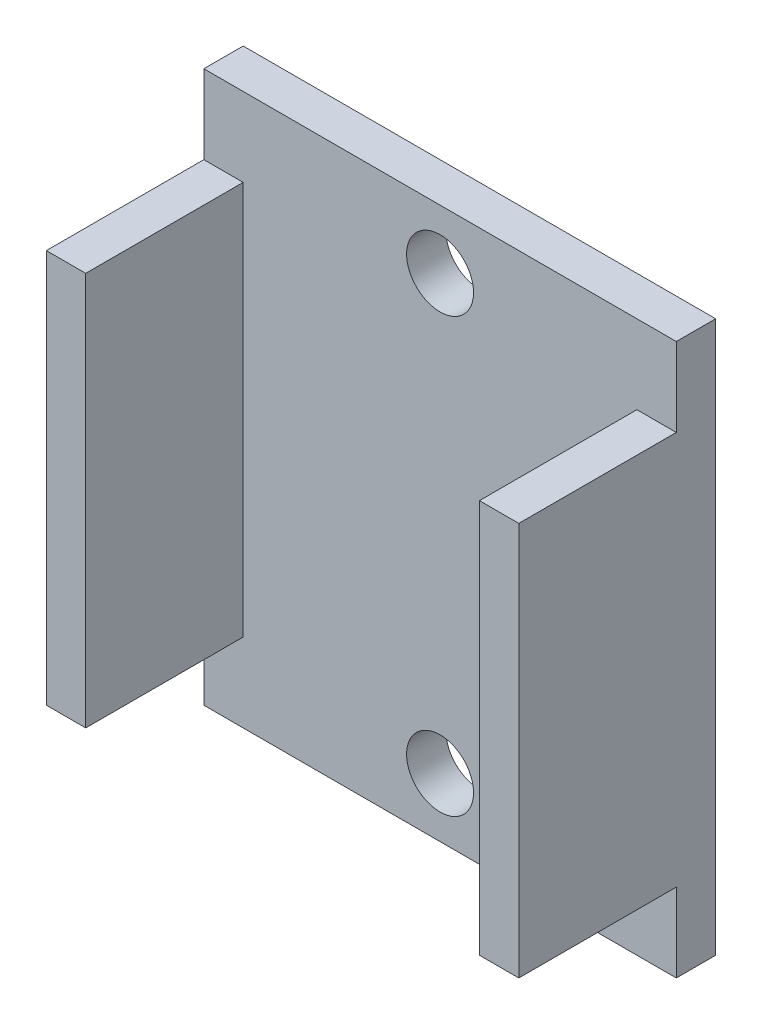
ISO-10303-21;
HEADER;
FILE_DESCRIPTION(('STEP AP214'),'2;1');
FILE_NAME('part.step','',(''),(''),'','','');
FILE_SCHEMA(('AUTOMOTIVE_DESIGN { 1 0 10303 214 1 1 1 1 }'));
ENDSEC;
DATA;
#1=APPLICATION_CONTEXT('core data for automotive mechanical design processes');
#2=APPLICATION_PROTOCOL_DEFINITION('international standard','automotive_design',2000,#1);
#3=PRODUCT_CONTEXT('',#1,'mechanical');
#4=PRODUCT('Part','Part','',(#3));
#5=PRODUCT_RELATED_PRODUCT_CATEGORY('part','',(#4));
#6=PRODUCT_DEFINITION_FORMATION('','',#4);
#7=PRODUCT_DEFINITION_CONTEXT('part definition',#1,'design');
#8=PRODUCT_DEFINITION('design','',#6,#7);
#9=PRODUCT_DEFINITION_SHAPE('','',#8);
#10=(LENGTH_UNIT() NAMED_UNIT(*) SI_UNIT(.MILLI.,.METRE.));
#11=(NAMED_UNIT(*) PLANE_ANGLE_UNIT() SI_UNIT($,.RADIAN.));
#12=(NAMED_UNIT(*) SI_UNIT($,.STERADIAN.) SOLID_ANGLE_UNIT());
#13=UNCERTAINTY_MEASURE_WITH_UNIT(LENGTH_MEASURE(1.E-05),#10,'distance_accuracy_value','');
#14=(GEOMETRIC_REPRESENTATION_CONTEXT(3) GLOBAL_UNCERTAINTY_ASSIGNED_CONTEXT((#13)) GLOBAL_UNIT_ASSIGNED_CONTEXT((#10,
#11,#12)) REPRESENTATION_CONTEXT('',''));
#15=CARTESIAN_POINT('',(0.,0.,0.));
#16=DIRECTION('',(0.,0.,1.));
#17=DIRECTION('',(1.,0.,0.));
#18=AXIS2_PLACEMENT_3D('',#15,#16,#17);
#19=CARTESIAN_POINT('',(0.,0.,90.));
#20=DIRECTION('',(0.,0.,-1.));
#21=DIRECTION('',(-1.,0.,0.));
#22=AXIS2_PLACEMENT_3D('',#19,#20,#21);
#23=PLANE('',#22);
#24=CARTESIAN_POINT('',(-190.,-11.,90.));
#25=DIRECTION('',(0.,0.,1.));
#26=DIRECTION('',(1.,0.,0.));
#27=AXIS2_PLACEMENT_3D('',#24,#25,#26);
#28=CIRCLE('',#27,1.70000000000001);
#29=CARTESIAN_POINT('',(-188.3,-11.,90.));
#30=VERTEX_POINT('',#29);
#31=EDGE_CURVE('E194',#30,#30,#28,.T.);
#32=ORIENTED_EDGE('',*,*,#31,.F.);
#33=EDGE_LOOP('',(#32));
#34=FACE_BOUND('',#33,.T.);
#35=CARTESIAN_POINT('',(-190.,11.,90.));
#36=DIRECTION('',(0.,0.,1.));
#37=DIRECTION('',(1.,0.,0.));
#38=AXIS2_PLACEMENT_3D('',#35,#36,#37);
#39=CIRCLE('',#38,1.70000000000001);
#40=CARTESIAN_POINT('',(-188.3,11.,90.));
#41=VERTEX_POINT('',#40);
#42=EDGE_CURVE('E153',#41,#41,#39,.T.);
#43=ORIENTED_EDGE('',*,*,#42,.F.);
#44=EDGE_LOOP('',(#43));
#45=FACE_BOUND('',#44,.T.);
#46=DIRECTION('',(-1.,0.,0.));
#47=VECTOR('',#46,1.);
#48=CARTESIAN_POINT('',(-180.,10.,90.));
#49=LINE('',#48,#47);
#50=CARTESIAN_POINT('',(-178.,10.,90.));
#51=VERTEX_POINT('',#50);
#52=CARTESIAN_POINT('',(-180.,10.,90.));
#53=VERTEX_POINT('',#52);
#54=EDGE_CURVE('E150',#51,#53,#49,.T.);
#55=ORIENTED_EDGE('',*,*,#54,.F.);
#56=DIRECTION('',(0.,1.,0.));
#57=VECTOR('',#56,1.);
#58=CARTESIAN_POINT('',(-178.,14.,90.));
#59=LINE('',#58,#57);
#60=CARTESIAN_POINT('',(-178.,14.,90.));
#61=VERTEX_POINT('',#60);
#62=EDGE_CURVE('E210',#51,#61,#59,.T.);
#63=ORIENTED_EDGE('',*,*,#62,.T.);
#64=DIRECTION('',(-1.,0.,0.));
#65=VECTOR('',#64,1.);
#66=CARTESIAN_POINT('',(-202.,14.,90.));
#67=LINE('',#66,#65);
#68=CARTESIAN_POINT('',(-202.,14.,90.));
#69=VERTEX_POINT('',#68);
#70=EDGE_CURVE('E196',#61,#69,#67,.T.);
#71=ORIENTED_EDGE('',*,*,#70,.T.);
#72=DIRECTION('',(0.,-1.,0.));
#73=VECTOR('',#72,1.);
#74=CARTESIAN_POINT('',(-202.,14.,90.));
#75=LINE('',#74,#73);
#76=CARTESIAN_POINT('',(-202.,10.,90.));
#77=VERTEX_POINT('',#76);
#78=EDGE_CURVE('E201',#69,#77,#75,.T.);
#79=ORIENTED_EDGE('',*,*,#78,.T.);
#80=DIRECTION('',(-1.,0.,0.));
#81=VECTOR('',#80,1.);
#82=CARTESIAN_POINT('',(-202.,10.,90.));
#83=LINE('',#82,#81);
#84=CARTESIAN_POINT('',(-200.,10.,90.));
#85=VERTEX_POINT('',#84);
#86=EDGE_CURVE('E171',#85,#77,#83,.T.);
#87=ORIENTED_EDGE('',*,*,#86,.F.);
#88=DIRECTION('',(0.,1.,0.));
#89=VECTOR('',#88,1.);
#90=CARTESIAN_POINT('',(-200.,10.,90.));
#91=LINE('',#90,#89);
#92=CARTESIAN_POINT('',(-200.,-10.,90.));
#93=VERTEX_POINT('',#92);
#94=EDGE_CURVE('E172',#93,#85,#91,.T.);
#95=ORIENTED_EDGE('',*,*,#94,.F.);
#96=DIRECTION('',(1.,0.,0.));
#97=VECTOR('',#96,1.);
#98=CARTESIAN_POINT('',(-202.,-10.,90.));
#99=LINE('',#98,#97);
#100=CARTESIAN_POINT('',(-202.,-10.,90.));
#101=VERTEX_POINT('',#100);
#102=EDGE_CURVE('E176',#101,#93,#99,.T.);
#103=ORIENTED_EDGE('',*,*,#102,.F.);
#104=CARTESIAN_POINT('',(-202.,-14.,90.));
#105=VERTEX_POINT('',#104);
#106=EDGE_CURVE('E203',#101,#105,#75,.T.);
#107=ORIENTED_EDGE('',*,*,#106,.T.);
#108=DIRECTION('',(1.,0.,0.));
#109=VECTOR('',#108,1.);
#110=CARTESIAN_POINT('',(-202.,-14.,90.));
#111=LINE('',#110,#109);
#112=CARTESIAN_POINT('',(-178.,-14.,90.));
#113=VERTEX_POINT('',#112);
#114=EDGE_CURVE('E202',#105,#113,#111,.T.);
#115=ORIENTED_EDGE('',*,*,#114,.T.);
#116=CARTESIAN_POINT('',(-178.,-10.,90.));
#117=VERTEX_POINT('',#116);
#118=EDGE_CURVE('E208',#113,#117,#59,.T.);
#119=ORIENTED_EDGE('',*,*,#118,.T.);
#120=DIRECTION('',(1.,0.,0.));
#121=VECTOR('',#120,1.);
#122=CARTESIAN_POINT('',(-180.,-10.,90.));
#123=LINE('',#122,#121);
#124=CARTESIAN_POINT('',(-180.,-10.,90.));
#125=VERTEX_POINT('',#124);
#126=EDGE_CURVE('E64',#125,#117,#123,.T.);
#127=ORIENTED_EDGE('',*,*,#126,.F.);
#128=DIRECTION('',(0.,-1.,0.));
#129=VECTOR('',#128,1.);
#130=CARTESIAN_POINT('',(-180.,10.,90.));
#131=LINE('',#130,#129);
#132=EDGE_CURVE('E57',#53,#125,#131,.T.);
#133=ORIENTED_EDGE('',*,*,#132,.F.);
#134=EDGE_LOOP('',(#55,#63,#71,#79,#87,#95,#103,#107,#115,#119,#127,#133));
#135=FACE_BOUND('',#134,.T.);
#136=ADVANCED_FACE('F41',(#34,#45,#135),#23,.F.);
#137=CARTESIAN_POINT('',(0.,0.,88.));
#138=DIRECTION('',(0.,0.,-1.));
#139=DIRECTION('',(-1.,0.,0.));
#140=AXIS2_PLACEMENT_3D('',#137,#138,#139);
#141=PLANE('',#140);
#142=CARTESIAN_POINT('',(-190.,-11.,88.));
#143=DIRECTION('',(0.,0.,1.));
#144=DIRECTION('',(1.,0.,0.));
#145=AXIS2_PLACEMENT_3D('',#142,#143,#144);
#146=CIRCLE('',#145,1.70000000000001);
#147=CARTESIAN_POINT('',(-188.3,-11.,88.));
#148=VERTEX_POINT('',#147);
#149=EDGE_CURVE('E187',#148,#148,#146,.T.);
#150=ORIENTED_EDGE('',*,*,#149,.T.);
#151=EDGE_LOOP('',(#150));
#152=FACE_BOUND('',#151,.T.);
#153=DIRECTION('',(-1.,0.,0.));
#154=VECTOR('',#153,1.);
#155=CARTESIAN_POINT('',(-202.,14.,88.));
#156=LINE('',#155,#154);
#157=CARTESIAN_POINT('',(-178.,14.,88.));
#158=VERTEX_POINT('',#157);
#159=CARTESIAN_POINT('',(-202.,14.,88.));
#160=VERTEX_POINT('',#159);
#161=EDGE_CURVE('E193',#158,#160,#156,.T.);
#162=ORIENTED_EDGE('',*,*,#161,.F.);
#163=DIRECTION('',(0.,1.,0.));
#164=VECTOR('',#163,1.);
#165=CARTESIAN_POINT('',(-178.,14.,88.));
#166=LINE('',#165,#164);
#167=CARTESIAN_POINT('',(-178.,-14.,88.));
#168=VERTEX_POINT('',#167);
#169=EDGE_CURVE('E205',#168,#158,#166,.T.);
#170=ORIENTED_EDGE('',*,*,#169,.F.);
#171=DIRECTION('',(1.,0.,0.));
#172=VECTOR('',#171,1.);
#173=CARTESIAN_POINT('',(-202.,-14.,88.));
#174=LINE('',#173,#172);
#175=CARTESIAN_POINT('',(-202.,-14.,88.));
#176=VERTEX_POINT('',#175);
#177=EDGE_CURVE('E214',#176,#168,#174,.T.);
#178=ORIENTED_EDGE('',*,*,#177,.F.);
#179=DIRECTION('',(0.,-1.,0.));
#180=VECTOR('',#179,1.);
#181=CARTESIAN_POINT('',(-202.,14.,88.));
#182=LINE('',#181,#180);
#183=EDGE_CURVE('E213',#160,#176,#182,.T.);
#184=ORIENTED_EDGE('',*,*,#183,.F.);
#185=EDGE_LOOP('',(#162,#170,#178,#184));
#186=FACE_BOUND('',#185,.T.);
#187=CARTESIAN_POINT('',(-190.,11.,88.));
#188=DIRECTION('',(0.,0.,1.));
#189=DIRECTION('',(1.,0.,0.));
#190=AXIS2_PLACEMENT_3D('',#187,#188,#189);
#191=CIRCLE('',#190,1.70000000000001);
#192=CARTESIAN_POINT('',(-188.3,11.,88.));
#193=VERTEX_POINT('',#192);
#194=EDGE_CURVE('E147',#193,#193,#191,.T.);
#195=ORIENTED_EDGE('',*,*,#194,.T.);
#196=EDGE_LOOP('',(#195));
#197=FACE_BOUND('',#196,.T.);
#198=ADVANCED_FACE('F231',(#152,#186,#197),#141,.T.);
#199=CARTESIAN_POINT('',(-202.,14.,90.));
#200=DIRECTION('',(0.,-1.,0.));
#201=DIRECTION('',(0.,0.,-1.));
#202=AXIS2_PLACEMENT_3D('',#199,#200,#201);
#203=PLANE('',#202);
#204=ORIENTED_EDGE('',*,*,#161,.T.);
#205=DIRECTION('',(0.,0.,-1.));
#206=VECTOR('',#205,1.);
#207=CARTESIAN_POINT('',(-202.,14.,90.));
#208=LINE('',#207,#206);
#209=EDGE_CURVE('E11',#69,#160,#208,.T.);
#210=ORIENTED_EDGE('',*,*,#209,.F.);
#211=ORIENTED_EDGE('',*,*,#70,.F.);
#212=DIRECTION('',(0.,0.,-1.));
#213=VECTOR('',#212,1.);
#214=CARTESIAN_POINT('',(-178.,14.,90.));
#215=LINE('',#214,#213);
#216=EDGE_CURVE('E209',#61,#158,#215,.T.);
#217=ORIENTED_EDGE('',*,*,#216,.T.);
#218=EDGE_LOOP('',(#204,#210,#211,#217));
#219=FACE_BOUND('',#218,.T.);
#220=ADVANCED_FACE('F43',(#219),#203,.F.);
#221=CARTESIAN_POINT('',(-202.,14.,90.));
#222=DIRECTION('',(1.,0.,0.));
#223=DIRECTION('',(0.,0.,-1.));
#224=AXIS2_PLACEMENT_3D('',#221,#222,#223);
#225=PLANE('',#224);
#226=ORIENTED_EDGE('',*,*,#183,.T.);
#227=DIRECTION('',(0.,0.,-1.));
#228=VECTOR('',#227,1.);
#229=CARTESIAN_POINT('',(-202.,-14.,90.));
#230=LINE('',#229,#228);
#231=EDGE_CURVE('E47',#105,#176,#230,.T.);
#232=ORIENTED_EDGE('',*,*,#231,.F.);
#233=ORIENTED_EDGE('',*,*,#106,.F.);
#234=DIRECTION('',(0.,0.,-1.));
#235=VECTOR('',#234,1.);
#236=CARTESIAN_POINT('',(-202.,-10.,98.));
#237=LINE('',#236,#235);
#238=CARTESIAN_POINT('',(-202.,-10.,98.));
#239=VERTEX_POINT('',#238);
#240=EDGE_CURVE('E157',#239,#101,#237,.T.);
#241=ORIENTED_EDGE('',*,*,#240,.F.);
#242=DIRECTION('',(0.,-1.,0.));
#243=VECTOR('',#242,1.);
#244=CARTESIAN_POINT('',(-202.,10.,98.));
#245=LINE('',#244,#243);
#246=CARTESIAN_POINT('',(-202.,10.,98.));
#247=VERTEX_POINT('',#246);
#248=EDGE_CURVE('E177',#247,#239,#245,.T.);
#249=ORIENTED_EDGE('',*,*,#248,.F.);
#250=DIRECTION('',(0.,0.,-1.));
#251=VECTOR('',#250,1.);
#252=CARTESIAN_POINT('',(-202.,10.,98.));
#253=LINE('',#252,#251);
#254=EDGE_CURVE('E169',#247,#77,#253,.T.);
#255=ORIENTED_EDGE('',*,*,#254,.T.);
#256=ORIENTED_EDGE('',*,*,#78,.F.);
#257=ORIENTED_EDGE('',*,*,#209,.T.);
#258=EDGE_LOOP('',(#226,#232,#233,#241,#249,#255,#256,#257));
#259=FACE_BOUND('',#258,.T.);
#260=ADVANCED_FACE('F258',(#259),#225,.F.);
#261=CARTESIAN_POINT('',(-202.,-14.,90.));
#262=DIRECTION('',(0.,1.,0.));
#263=DIRECTION('',(0.,0.,1.));
#264=AXIS2_PLACEMENT_3D('',#261,#262,#263);
#265=PLANE('',#264);
#266=ORIENTED_EDGE('',*,*,#177,.T.);
#267=DIRECTION('',(0.,0.,-1.));
#268=VECTOR('',#267,1.);
#269=CARTESIAN_POINT('',(-178.,-14.,90.));
#270=LINE('',#269,#268);
#271=EDGE_CURVE('E219',#113,#168,#270,.T.);
#272=ORIENTED_EDGE('',*,*,#271,.F.);
#273=ORIENTED_EDGE('',*,*,#114,.F.);
#274=ORIENTED_EDGE('',*,*,#231,.T.);
#275=EDGE_LOOP('',(#266,#272,#273,#274));
#276=FACE_BOUND('',#275,.T.);
#277=ADVANCED_FACE('F226',(#276),#265,.F.);
#278=CARTESIAN_POINT('',(-178.,14.,90.));
#279=DIRECTION('',(-1.,0.,0.));
#280=DIRECTION('',(0.,0.,1.));
#281=AXIS2_PLACEMENT_3D('',#278,#279,#280);
#282=PLANE('',#281);
#283=ORIENTED_EDGE('',*,*,#169,.T.);
#284=ORIENTED_EDGE('',*,*,#216,.F.);
#285=ORIENTED_EDGE('',*,*,#62,.F.);
#286=DIRECTION('',(0.,0.,-1.));
#287=VECTOR('',#286,1.);
#288=CARTESIAN_POINT('',(-178.,10.,98.));
#289=LINE('',#288,#287);
#290=CARTESIAN_POINT('',(-178.,10.,98.));
#291=VERTEX_POINT('',#290);
#292=EDGE_CURVE('E154',#291,#51,#289,.T.);
#293=ORIENTED_EDGE('',*,*,#292,.F.);
#294=DIRECTION('',(0.,1.,0.));
#295=VECTOR('',#294,1.);
#296=CARTESIAN_POINT('',(-178.,10.,98.));
#297=LINE('',#296,#295);
#298=CARTESIAN_POINT('',(-178.,-10.,98.));
#299=VERTEX_POINT('',#298);
#300=EDGE_CURVE('E139',#299,#291,#297,.T.);
#301=ORIENTED_EDGE('',*,*,#300,.F.);
#302=DIRECTION('',(0.,0.,-1.));
#303=VECTOR('',#302,1.);
#304=CARTESIAN_POINT('',(-178.,-10.,98.));
#305=LINE('',#304,#303);
#306=EDGE_CURVE('E133',#299,#117,#305,.T.);
#307=ORIENTED_EDGE('',*,*,#306,.T.);
#308=ORIENTED_EDGE('',*,*,#118,.F.);
#309=ORIENTED_EDGE('',*,*,#271,.T.);
#310=EDGE_LOOP('',(#283,#284,#285,#293,#301,#307,#308,#309));
#311=FACE_BOUND('',#310,.T.);
#312=ADVANCED_FACE('F236',(#311),#282,.F.);
#313=CARTESIAN_POINT('',(-190.,-11.,90.));
#314=DIRECTION('',(0.,0.,-1.));
#315=DIRECTION('',(-1.,0.,0.));
#316=AXIS2_PLACEMENT_3D('',#313,#314,#315);
#317=CYLINDRICAL_SURFACE('',#316,1.70000000000001);
#318=ORIENTED_EDGE('',*,*,#31,.T.);
#319=EDGE_LOOP('',(#318));
#320=FACE_BOUND('',#319,.T.);
#321=ORIENTED_EDGE('',*,*,#149,.F.);
#322=EDGE_LOOP('',(#321));
#323=FACE_BOUND('',#322,.T.);
#324=ADVANCED_FACE('F291',(#320,#323),#317,.F.);
#325=CARTESIAN_POINT('',(-190.,11.,90.));
#326=DIRECTION('',(0.,0.,-1.));
#327=DIRECTION('',(-1.,0.,0.));
#328=AXIS2_PLACEMENT_3D('',#325,#326,#327);
#329=CYLINDRICAL_SURFACE('',#328,1.70000000000001);
#330=ORIENTED_EDGE('',*,*,#42,.T.);
#331=EDGE_LOOP('',(#330));
#332=FACE_BOUND('',#331,.T.);
#333=ORIENTED_EDGE('',*,*,#194,.F.);
#334=EDGE_LOOP('',(#333));
#335=FACE_BOUND('',#334,.T.);
#336=ADVANCED_FACE('F279',(#332,#335),#329,.F.);
#337=CARTESIAN_POINT('',(-202.,-10.,98.));
#338=DIRECTION('',(0.,1.,0.));
#339=DIRECTION('',(0.,0.,1.));
#340=AXIS2_PLACEMENT_3D('',#337,#338,#339);
#341=PLANE('',#340);
#342=ORIENTED_EDGE('',*,*,#102,.T.);
#343=DIRECTION('',(0.,0.,-1.));
#344=VECTOR('',#343,1.);
#345=CARTESIAN_POINT('',(-200.,-10.,98.));
#346=LINE('',#345,#344);
#347=CARTESIAN_POINT('',(-200.,-10.,98.));
#348=VERTEX_POINT('',#347);
#349=EDGE_CURVE('E165',#348,#93,#346,.T.);
#350=ORIENTED_EDGE('',*,*,#349,.F.);
#351=DIRECTION('',(1.,0.,0.));
#352=VECTOR('',#351,1.);
#353=CARTESIAN_POINT('',(-202.,-10.,98.));
#354=LINE('',#353,#352);
#355=EDGE_CURVE('E183',#239,#348,#354,.T.);
#356=ORIENTED_EDGE('',*,*,#355,.F.);
#357=ORIENTED_EDGE('',*,*,#240,.T.);
#358=EDGE_LOOP('',(#342,#350,#356,#357));
#359=FACE_BOUND('',#358,.T.);
#360=ADVANCED_FACE('F259',(#359),#341,.F.);
#361=CARTESIAN_POINT('',(-200.,10.,98.));
#362=DIRECTION('',(-1.,0.,0.));
#363=DIRECTION('',(0.,0.,1.));
#364=AXIS2_PLACEMENT_3D('',#361,#362,#363);
#365=PLANE('',#364);
#366=ORIENTED_EDGE('',*,*,#94,.T.);
#367=DIRECTION('',(0.,0.,-1.));
#368=VECTOR('',#367,1.);
#369=CARTESIAN_POINT('',(-200.,10.,98.));
#370=LINE('',#369,#368);
#371=CARTESIAN_POINT('',(-200.,10.,98.));
#372=VERTEX_POINT('',#371);
#373=EDGE_CURVE('E164',#372,#85,#370,.T.);
#374=ORIENTED_EDGE('',*,*,#373,.F.);
#375=DIRECTION('',(0.,1.,0.));
#376=VECTOR('',#375,1.);
#377=CARTESIAN_POINT('',(-200.,10.,98.));
#378=LINE('',#377,#376);
#379=EDGE_CURVE('E181',#348,#372,#378,.T.);
#380=ORIENTED_EDGE('',*,*,#379,.F.);
#381=ORIENTED_EDGE('',*,*,#349,.T.);
#382=EDGE_LOOP('',(#366,#374,#380,#381));
#383=FACE_BOUND('',#382,.T.);
#384=ADVANCED_FACE('F269',(#383),#365,.F.);
#385=CARTESIAN_POINT('',(-202.,10.,98.));
#386=DIRECTION('',(0.,-1.,0.));
#387=DIRECTION('',(0.,0.,-1.));
#388=AXIS2_PLACEMENT_3D('',#385,#386,#387);
#389=PLANE('',#388);
#390=ORIENTED_EDGE('',*,*,#86,.T.);
#391=ORIENTED_EDGE('',*,*,#254,.F.);
#392=DIRECTION('',(-1.,0.,0.));
#393=VECTOR('',#392,1.);
#394=CARTESIAN_POINT('',(-202.,10.,98.));
#395=LINE('',#394,#393);
#396=EDGE_CURVE('E174',#372,#247,#395,.T.);
#397=ORIENTED_EDGE('',*,*,#396,.F.);
#398=ORIENTED_EDGE('',*,*,#373,.T.);
#399=EDGE_LOOP('',(#390,#391,#397,#398));
#400=FACE_BOUND('',#399,.T.);
#401=ADVANCED_FACE('F270',(#400),#389,.F.);
#402=CARTESIAN_POINT('',(0.,0.,98.));
#403=DIRECTION('',(0.,0.,1.));
#404=DIRECTION('',(1.,0.,0.));
#405=AXIS2_PLACEMENT_3D('',#402,#403,#404);
#406=PLANE('',#405);
#407=ORIENTED_EDGE('',*,*,#248,.T.);
#408=ORIENTED_EDGE('',*,*,#355,.T.);
#409=ORIENTED_EDGE('',*,*,#379,.T.);
#410=ORIENTED_EDGE('',*,*,#396,.T.);
#411=EDGE_LOOP('',(#407,#408,#409,#410));
#412=FACE_BOUND('',#411,.T.);
#413=ADVANCED_FACE('F263',(#412),#406,.T.);
#414=CARTESIAN_POINT('',(-180.,10.,98.));
#415=DIRECTION('',(1.,0.,0.));
#416=DIRECTION('',(0.,0.,-1.));
#417=AXIS2_PLACEMENT_3D('',#414,#415,#416);
#418=PLANE('',#417);
#419=ORIENTED_EDGE('',*,*,#132,.T.);
#420=DIRECTION('',(0.,0.,-1.));
#421=VECTOR('',#420,1.);
#422=CARTESIAN_POINT('',(-180.,-10.,98.));
#423=LINE('',#422,#421);
#424=CARTESIAN_POINT('',(-180.,-10.,98.));
#425=VERTEX_POINT('',#424);
#426=EDGE_CURVE('E131',#425,#125,#423,.T.);
#427=ORIENTED_EDGE('',*,*,#426,.F.);
#428=DIRECTION('',(0.,-1.,0.));
#429=VECTOR('',#428,1.);
#430=CARTESIAN_POINT('',(-180.,10.,98.));
#431=LINE('',#430,#429);
#432=CARTESIAN_POINT('',(-180.,10.,98.));
#433=VERTEX_POINT('',#432);
#434=EDGE_CURVE('E140',#433,#425,#431,.T.);
#435=ORIENTED_EDGE('',*,*,#434,.F.);
#436=DIRECTION('',(0.,0.,-1.));
#437=VECTOR('',#436,1.);
#438=CARTESIAN_POINT('',(-180.,10.,98.));
#439=LINE('',#438,#437);
#440=EDGE_CURVE('E250',#433,#53,#439,.T.);
#441=ORIENTED_EDGE('',*,*,#440,.T.);
#442=EDGE_LOOP('',(#419,#427,#435,#441));
#443=FACE_BOUND('',#442,.T.);
#444=ADVANCED_FACE('F149',(#443),#418,.F.);
#445=CARTESIAN_POINT('',(-180.,-10.,98.));
#446=DIRECTION('',(0.,1.,0.));
#447=DIRECTION('',(0.,0.,1.));
#448=AXIS2_PLACEMENT_3D('',#445,#446,#447);
#449=PLANE('',#448);
#450=ORIENTED_EDGE('',*,*,#126,.T.);
#451=ORIENTED_EDGE('',*,*,#306,.F.);
#452=DIRECTION('',(1.,0.,0.));
#453=VECTOR('',#452,1.);
#454=CARTESIAN_POINT('',(-180.,-10.,98.));
#455=LINE('',#454,#453);
#456=EDGE_CURVE('E126',#425,#299,#455,.T.);
#457=ORIENTED_EDGE('',*,*,#456,.F.);
#458=ORIENTED_EDGE('',*,*,#426,.T.);
#459=EDGE_LOOP('',(#450,#451,#457,#458));
#460=FACE_BOUND('',#459,.T.);
#461=ADVANCED_FACE('F128',(#460),#449,.F.);
#462=CARTESIAN_POINT('',(-180.,10.,98.));
#463=DIRECTION('',(0.,-1.,0.));
#464=DIRECTION('',(0.,0.,-1.));
#465=AXIS2_PLACEMENT_3D('',#462,#463,#464);
#466=PLANE('',#465);
#467=ORIENTED_EDGE('',*,*,#54,.T.);
#468=ORIENTED_EDGE('',*,*,#440,.F.);
#469=DIRECTION('',(-1.,0.,0.));
#470=VECTOR('',#469,1.);
#471=CARTESIAN_POINT('',(-180.,10.,98.));
#472=LINE('',#471,#470);
#473=EDGE_CURVE('E141',#291,#433,#472,.T.);
#474=ORIENTED_EDGE('',*,*,#473,.F.);
#475=ORIENTED_EDGE('',*,*,#292,.T.);
#476=EDGE_LOOP('',(#467,#468,#474,#475));
#477=FACE_BOUND('',#476,.T.);
#478=ADVANCED_FACE('F249',(#477),#466,.F.);
#479=CARTESIAN_POINT('',(0.,0.,98.));
#480=DIRECTION('',(0.,0.,1.));
#481=DIRECTION('',(1.,0.,0.));
#482=AXIS2_PLACEMENT_3D('',#479,#480,#481);
#483=PLANE('',#482);
#484=ORIENTED_EDGE('',*,*,#434,.T.);
#485=ORIENTED_EDGE('',*,*,#456,.T.);
#486=ORIENTED_EDGE('',*,*,#300,.T.);
#487=ORIENTED_EDGE('',*,*,#473,.T.);
#488=EDGE_LOOP('',(#484,#485,#486,#487));
#489=FACE_BOUND('',#488,.T.);
#490=ADVANCED_FACE('F143',(#489),#483,.T.);
#491=CLOSED_SHELL('',(#136,#198,#220,#260,#277,#312,#324,#336,#360,#384,#401,#413,#444,#461,
#478,#490));
#492=MANIFOLD_SOLID_BREP('B2',#491);
#493=ADVANCED_BREP_SHAPE_REPRESENTATION('',(#18,#492),#14);
#494=SHAPE_DEFINITION_REPRESENTATION(#9,#493);
ENDSEC;
END-ISO-10303-21;
